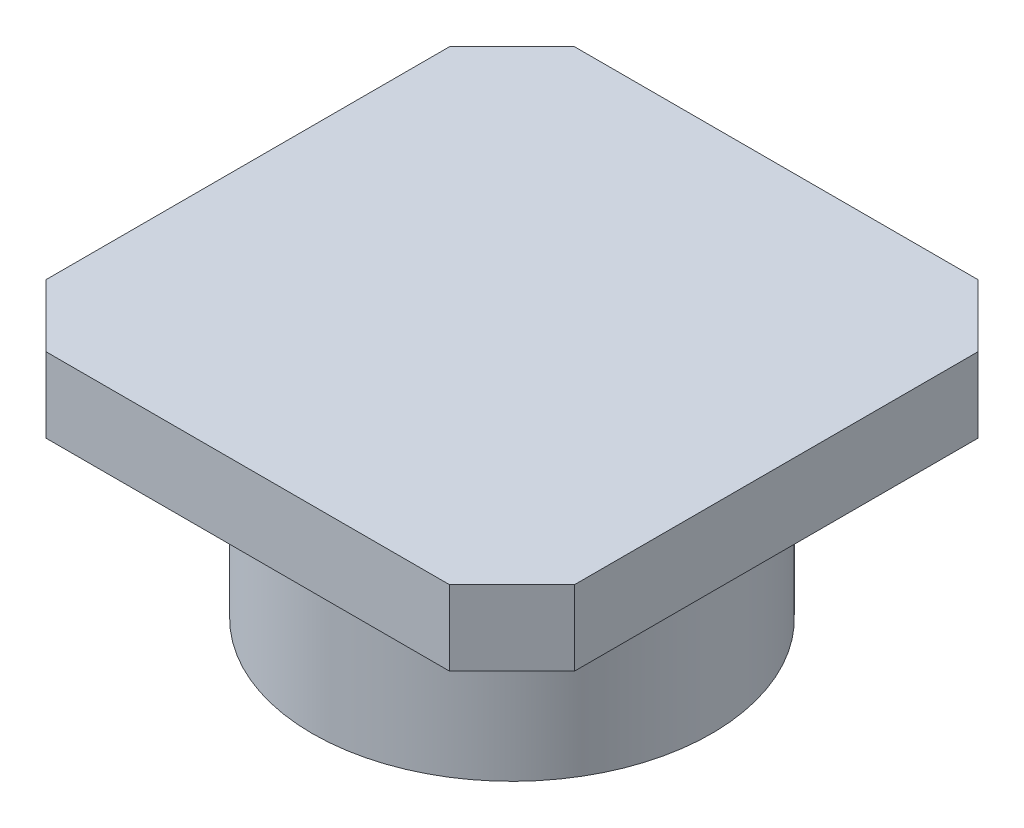
ISO-10303-21;
HEADER;
FILE_DESCRIPTION(('STEP AP214'),'2;1');
FILE_NAME('part.step','',(''),(''),'','','');
FILE_SCHEMA(('AUTOMOTIVE_DESIGN { 1 0 10303 214 1 1 1 1 }'));
ENDSEC;
DATA;
#1=APPLICATION_CONTEXT('core data for automotive mechanical design processes');
#2=APPLICATION_PROTOCOL_DEFINITION('international standard','automotive_design',2000,#1);
#3=PRODUCT_CONTEXT('',#1,'mechanical');
#4=PRODUCT('Part','Part','',(#3));
#5=PRODUCT_RELATED_PRODUCT_CATEGORY('part','',(#4));
#6=PRODUCT_DEFINITION_FORMATION('','',#4);
#7=PRODUCT_DEFINITION_CONTEXT('part definition',#1,'design');
#8=PRODUCT_DEFINITION('design','',#6,#7);
#9=PRODUCT_DEFINITION_SHAPE('','',#8);
#10=(LENGTH_UNIT() NAMED_UNIT(*) SI_UNIT(.MILLI.,.METRE.));
#11=(NAMED_UNIT(*) PLANE_ANGLE_UNIT() SI_UNIT($,.RADIAN.));
#12=(NAMED_UNIT(*) SI_UNIT($,.STERADIAN.) SOLID_ANGLE_UNIT());
#13=UNCERTAINTY_MEASURE_WITH_UNIT(LENGTH_MEASURE(1.E-05),#10,'distance_accuracy_value','');
#14=(GEOMETRIC_REPRESENTATION_CONTEXT(3) GLOBAL_UNCERTAINTY_ASSIGNED_CONTEXT((#13)) GLOBAL_UNIT_ASSIGNED_CONTEXT((#10,
#11,#12)) REPRESENTATION_CONTEXT('',''));
#15=CARTESIAN_POINT('',(0.,0.,0.));
#16=DIRECTION('',(0.,0.,1.));
#17=DIRECTION('',(1.,0.,0.));
#18=AXIS2_PLACEMENT_3D('',#15,#16,#17);
#19=CARTESIAN_POINT('',(0.,15.,0.));
#20=DIRECTION('',(0.,1.,0.));
#21=DIRECTION('',(0.,0.,1.));
#22=AXIS2_PLACEMENT_3D('',#19,#20,#21);
#23=PLANE('',#22);
#24=CARTESIAN_POINT('',(0.,15.,0.));
#25=DIRECTION('',(0.,1.,0.));
#26=DIRECTION('',(0.,0.,1.));
#27=AXIS2_PLACEMENT_3D('',#24,#25,#26);
#28=CIRCLE('',#27,18.);
#29=CARTESIAN_POINT('',(0.,15.,18.));
#30=VERTEX_POINT('',#29);
#31=EDGE_CURVE('E38',#30,#30,#28,.T.);
#32=ORIENTED_EDGE('',*,*,#31,.T.);
#33=EDGE_LOOP('',(#32));
#34=FACE_BOUND('',#33,.T.);
#35=DIRECTION('',(0.,0.,1.));
#36=VECTOR('',#35,1.);
#37=CARTESIAN_POINT('',(-21.169262219772,15.,0.));
#38=LINE('',#37,#36);
#39=CARTESIAN_POINT('',(-21.169262219772,15.,-16.169262219772));
#40=VERTEX_POINT('',#39);
#41=CARTESIAN_POINT('',(-21.169262219772,15.,16.169262219772));
#42=VERTEX_POINT('',#41);
#43=EDGE_CURVE('E156',#40,#42,#38,.T.);
#44=ORIENTED_EDGE('',*,*,#43,.F.);
#45=DIRECTION('',(-0.707106781186547,0.,0.707106781186548));
#46=VECTOR('',#45,1.);
#47=CARTESIAN_POINT('',(-18.669262219772,15.,-18.669262219772));
#48=LINE('',#47,#46);
#49=CARTESIAN_POINT('',(-16.169262219772,15.,-21.169262219772));
#50=VERTEX_POINT('',#49);
#51=EDGE_CURVE('E154',#50,#40,#48,.T.);
#52=ORIENTED_EDGE('',*,*,#51,.F.);
#53=DIRECTION('',(-1.,0.,0.));
#54=VECTOR('',#53,1.);
#55=CARTESIAN_POINT('',(0.,15.,-21.169262219772));
#56=LINE('',#55,#54);
#57=CARTESIAN_POINT('',(16.169262219772,15.,-21.169262219772));
#58=VERTEX_POINT('',#57);
#59=EDGE_CURVE('E152',#58,#50,#56,.T.);
#60=ORIENTED_EDGE('',*,*,#59,.F.);
#61=DIRECTION('',(-0.707106781186548,0.,-0.707106781186548));
#62=VECTOR('',#61,1.);
#63=CARTESIAN_POINT('',(18.669262219772,15.,-18.669262219772));
#64=LINE('',#63,#62);
#65=CARTESIAN_POINT('',(21.169262219772,15.,-16.169262219772));
#66=VERTEX_POINT('',#65);
#67=EDGE_CURVE('E150',#66,#58,#64,.T.);
#68=ORIENTED_EDGE('',*,*,#67,.F.);
#69=DIRECTION('',(0.,0.,-1.));
#70=VECTOR('',#69,1.);
#71=CARTESIAN_POINT('',(21.169262219772,15.,0.));
#72=LINE('',#71,#70);
#73=CARTESIAN_POINT('',(21.169262219772,15.,16.169262219772));
#74=VERTEX_POINT('',#73);
#75=EDGE_CURVE('E148',#74,#66,#72,.T.);
#76=ORIENTED_EDGE('',*,*,#75,.F.);
#77=DIRECTION('',(0.707106781186548,0.,-0.707106781186548));
#78=VECTOR('',#77,1.);
#79=CARTESIAN_POINT('',(18.669262219772,15.,18.669262219772));
#80=LINE('',#79,#78);
#81=CARTESIAN_POINT('',(16.169262219772,15.,21.169262219772));
#82=VERTEX_POINT('',#81);
#83=EDGE_CURVE('E146',#82,#74,#80,.T.);
#84=ORIENTED_EDGE('',*,*,#83,.F.);
#85=DIRECTION('',(1.,0.,0.));
#86=VECTOR('',#85,1.);
#87=CARTESIAN_POINT('',(0.,15.,21.169262219772));
#88=LINE('',#87,#86);
#89=CARTESIAN_POINT('',(-16.169262219772,15.,21.169262219772));
#90=VERTEX_POINT('',#89);
#91=EDGE_CURVE('E98',#90,#82,#88,.T.);
#92=ORIENTED_EDGE('',*,*,#91,.F.);
#93=DIRECTION('',(0.707106781186548,0.,0.707106781186547));
#94=VECTOR('',#93,1.);
#95=CARTESIAN_POINT('',(-18.669262219772,15.,18.669262219772));
#96=LINE('',#95,#94);
#97=EDGE_CURVE('E134',#42,#90,#96,.T.);
#98=ORIENTED_EDGE('',*,*,#97,.F.);
#99=EDGE_LOOP('',(#44,#52,#60,#68,#76,#84,#92,#98));
#100=FACE_BOUND('',#99,.T.);
#101=ADVANCED_FACE('F30',(#34,#100),#23,.F.);
#102=CARTESIAN_POINT('',(0.,0.,0.));
#103=DIRECTION('',(0.,1.,0.));
#104=DIRECTION('',(0.,0.,1.));
#105=AXIS2_PLACEMENT_3D('',#102,#103,#104);
#106=PLANE('',#105);
#107=CARTESIAN_POINT('',(0.,0.,0.));
#108=DIRECTION('',(0.,1.,0.));
#109=DIRECTION('',(0.,0.,1.));
#110=AXIS2_PLACEMENT_3D('',#107,#108,#109);
#111=CIRCLE('',#110,16.);
#112=CARTESIAN_POINT('',(0.,0.,16.));
#113=VERTEX_POINT('',#112);
#114=EDGE_CURVE('E164',#113,#113,#111,.T.);
#115=ORIENTED_EDGE('',*,*,#114,.F.);
#116=EDGE_LOOP('',(#115));
#117=FACE_BOUND('',#116,.T.);
#118=CARTESIAN_POINT('',(0.,0.,0.));
#119=DIRECTION('',(0.,1.,0.));
#120=DIRECTION('',(0.,0.,1.));
#121=AXIS2_PLACEMENT_3D('',#118,#119,#120);
#122=CIRCLE('',#121,12.5);
#123=CARTESIAN_POINT('',(0.,0.,12.5));
#124=VERTEX_POINT('',#123);
#125=EDGE_CURVE('E161',#124,#124,#122,.T.);
#126=ORIENTED_EDGE('',*,*,#125,.T.);
#127=EDGE_LOOP('',(#126));
#128=FACE_BOUND('',#127,.T.);
#129=ADVANCED_FACE('F187',(#117,#128),#106,.F.);
#130=CARTESIAN_POINT('',(0.,15.,0.));
#131=DIRECTION('',(0.,-1.,0.));
#132=DIRECTION('',(0.,0.,-1.));
#133=AXIS2_PLACEMENT_3D('',#130,#131,#132);
#134=CYLINDRICAL_SURFACE('',#133,16.);
#135=CARTESIAN_POINT('',(0.,13.,0.));
#136=DIRECTION('',(0.,1.,0.));
#137=DIRECTION('',(0.,0.,1.));
#138=AXIS2_PLACEMENT_3D('',#135,#136,#137);
#139=CIRCLE('',#138,16.);
#140=CARTESIAN_POINT('',(0.,13.,16.));
#141=VERTEX_POINT('',#140);
#142=EDGE_CURVE('E11',#141,#141,#139,.F.);
#143=ORIENTED_EDGE('',*,*,#142,.T.);
#144=EDGE_LOOP('',(#143));
#145=FACE_BOUND('',#144,.T.);
#146=ORIENTED_EDGE('',*,*,#114,.T.);
#147=EDGE_LOOP('',(#146));
#148=FACE_BOUND('',#147,.T.);
#149=ADVANCED_FACE('F191',(#145,#148),#134,.T.);
#150=CARTESIAN_POINT('',(0.,15.,0.));
#151=DIRECTION('',(0.,-1.,0.));
#152=DIRECTION('',(0.,0.,-1.));
#153=AXIS2_PLACEMENT_3D('',#150,#151,#152);
#154=CYLINDRICAL_SURFACE('',#153,12.5);
#155=CARTESIAN_POINT('',(0.,15.,0.));
#156=DIRECTION('',(0.,1.,0.));
#157=DIRECTION('',(0.,0.,1.));
#158=AXIS2_PLACEMENT_3D('',#155,#156,#157);
#159=CIRCLE('',#158,12.5);
#160=CARTESIAN_POINT('',(0.,15.,12.5));
#161=VERTEX_POINT('',#160);
#162=EDGE_CURVE('E158',#161,#161,#159,.T.);
#163=ORIENTED_EDGE('',*,*,#162,.T.);
#164=EDGE_LOOP('',(#163));
#165=FACE_BOUND('',#164,.T.);
#166=ORIENTED_EDGE('',*,*,#125,.F.);
#167=EDGE_LOOP('',(#166));
#168=FACE_BOUND('',#167,.T.);
#169=ADVANCED_FACE('F182',(#165,#168),#154,.F.);
#170=ORIENTED_EDGE('',*,*,#162,.F.);
#171=EDGE_LOOP('',(#170));
#172=FACE_BOUND('',#171,.T.);
#173=ADVANCED_FACE('F173',(#172),#23,.F.);
#174=CARTESIAN_POINT('',(0.,13.,0.));
#175=DIRECTION('',(0.,1.,0.));
#176=DIRECTION('',(0.,0.,1.));
#177=AXIS2_PLACEMENT_3D('',#174,#175,#176);
#178=TOROIDAL_SURFACE('',#177,18.,2.);
#179=ORIENTED_EDGE('',*,*,#142,.F.);
#180=EDGE_LOOP('',(#179));
#181=FACE_BOUND('',#180,.T.);
#182=ORIENTED_EDGE('',*,*,#31,.F.);
#183=EDGE_LOOP('',(#182));
#184=FACE_BOUND('',#183,.T.);
#185=ADVANCED_FACE('F32',(#181,#184),#178,.F.);
#186=CARTESIAN_POINT('',(-21.169262219772,11.,16.169262219772));
#187=DIRECTION('',(-1.,0.,0.));
#188=DIRECTION('',(0.,0.,1.));
#189=AXIS2_PLACEMENT_3D('',#186,#187,#188);
#190=PLANE('',#189);
#191=ORIENTED_EDGE('',*,*,#43,.T.);
#192=DIRECTION('',(0.,1.,0.));
#193=VECTOR('',#192,1.);
#194=CARTESIAN_POINT('',(-21.169262219772,11.,16.169262219772));
#195=LINE('',#194,#193);
#196=CARTESIAN_POINT('',(-21.169262219772,21.,16.169262219772));
#197=VERTEX_POINT('',#196);
#198=EDGE_CURVE('E45',#42,#197,#195,.T.);
#199=ORIENTED_EDGE('',*,*,#198,.T.);
#200=DIRECTION('',(0.,0.,1.));
#201=VECTOR('',#200,1.);
#202=CARTESIAN_POINT('',(-21.169262219772,21.,16.169262219772));
#203=LINE('',#202,#201);
#204=CARTESIAN_POINT('',(-21.169262219772,21.,-16.169262219772));
#205=VERTEX_POINT('',#204);
#206=EDGE_CURVE('E119',#205,#197,#203,.T.);
#207=ORIENTED_EDGE('',*,*,#206,.F.);
#208=DIRECTION('',(0.,1.,0.));
#209=VECTOR('',#208,1.);
#210=CARTESIAN_POINT('',(-21.169262219772,11.,-16.169262219772));
#211=LINE('',#210,#209);
#212=EDGE_CURVE('E132',#40,#205,#211,.T.);
#213=ORIENTED_EDGE('',*,*,#212,.F.);
#214=EDGE_LOOP('',(#191,#199,#207,#213));
#215=FACE_BOUND('',#214,.T.);
#216=ADVANCED_FACE('F172',(#215),#190,.T.);
#217=CARTESIAN_POINT('',(-21.169262219772,11.,-16.169262219772));
#218=DIRECTION('',(-0.707106781186548,0.,-0.707106781186547));
#219=DIRECTION('',(-0.707106781186547,0.,0.707106781186548));
#220=AXIS2_PLACEMENT_3D('',#217,#218,#219);
#221=PLANE('',#220);
#222=ORIENTED_EDGE('',*,*,#51,.T.);
#223=ORIENTED_EDGE('',*,*,#212,.T.);
#224=DIRECTION('',(-0.707106781186547,0.,0.707106781186548));
#225=VECTOR('',#224,1.);
#226=CARTESIAN_POINT('',(-21.169262219772,21.,-16.169262219772));
#227=LINE('',#226,#225);
#228=CARTESIAN_POINT('',(-16.169262219772,21.,-21.169262219772));
#229=VERTEX_POINT('',#228);
#230=EDGE_CURVE('E130',#229,#205,#227,.T.);
#231=ORIENTED_EDGE('',*,*,#230,.F.);
#232=DIRECTION('',(0.,1.,0.));
#233=VECTOR('',#232,1.);
#234=CARTESIAN_POINT('',(-16.169262219772,11.,-21.169262219772));
#235=LINE('',#234,#233);
#236=EDGE_CURVE('E135',#50,#229,#235,.T.);
#237=ORIENTED_EDGE('',*,*,#236,.F.);
#238=EDGE_LOOP('',(#222,#223,#231,#237));
#239=FACE_BOUND('',#238,.T.);
#240=ADVANCED_FACE('F179',(#239),#221,.T.);
#241=CARTESIAN_POINT('',(-16.169262219772,11.,-21.169262219772));
#242=DIRECTION('',(0.,0.,-1.));
#243=DIRECTION('',(-1.,0.,0.));
#244=AXIS2_PLACEMENT_3D('',#241,#242,#243);
#245=PLANE('',#244);
#246=ORIENTED_EDGE('',*,*,#59,.T.);
#247=ORIENTED_EDGE('',*,*,#236,.T.);
#248=DIRECTION('',(-1.,0.,0.));
#249=VECTOR('',#248,1.);
#250=CARTESIAN_POINT('',(-16.169262219772,21.,-21.169262219772));
#251=LINE('',#250,#249);
#252=CARTESIAN_POINT('',(16.169262219772,21.,-21.169262219772));
#253=VERTEX_POINT('',#252);
#254=EDGE_CURVE('E127',#253,#229,#251,.T.);
#255=ORIENTED_EDGE('',*,*,#254,.F.);
#256=DIRECTION('',(0.,1.,0.));
#257=VECTOR('',#256,1.);
#258=CARTESIAN_POINT('',(16.169262219772,11.,-21.169262219772));
#259=LINE('',#258,#257);
#260=EDGE_CURVE('E137',#58,#253,#259,.T.);
#261=ORIENTED_EDGE('',*,*,#260,.F.);
#262=EDGE_LOOP('',(#246,#247,#255,#261));
#263=FACE_BOUND('',#262,.T.);
#264=ADVANCED_FACE('F250',(#263),#245,.T.);
#265=CARTESIAN_POINT('',(16.169262219772,11.,-21.169262219772));
#266=DIRECTION('',(0.707106781186548,0.,-0.707106781186548));
#267=DIRECTION('',(-0.707106781186548,0.,-0.707106781186548));
#268=AXIS2_PLACEMENT_3D('',#265,#266,#267);
#269=PLANE('',#268);
#270=ORIENTED_EDGE('',*,*,#67,.T.);
#271=ORIENTED_EDGE('',*,*,#260,.T.);
#272=DIRECTION('',(-0.707106781186548,0.,-0.707106781186548));
#273=VECTOR('',#272,1.);
#274=CARTESIAN_POINT('',(16.169262219772,21.,-21.169262219772));
#275=LINE('',#274,#273);
#276=CARTESIAN_POINT('',(21.169262219772,21.,-16.169262219772));
#277=VERTEX_POINT('',#276);
#278=EDGE_CURVE('E124',#277,#253,#275,.T.);
#279=ORIENTED_EDGE('',*,*,#278,.F.);
#280=DIRECTION('',(0.,1.,0.));
#281=VECTOR('',#280,1.);
#282=CARTESIAN_POINT('',(21.169262219772,11.,-16.169262219772));
#283=LINE('',#282,#281);
#284=EDGE_CURVE('E139',#66,#277,#283,.T.);
#285=ORIENTED_EDGE('',*,*,#284,.F.);
#286=EDGE_LOOP('',(#270,#271,#279,#285));
#287=FACE_BOUND('',#286,.T.);
#288=ADVANCED_FACE('F259',(#287),#269,.T.);
#289=CARTESIAN_POINT('',(21.169262219772,11.,16.169262219772));
#290=DIRECTION('',(1.,0.,0.));
#291=DIRECTION('',(0.,0.,-1.));
#292=AXIS2_PLACEMENT_3D('',#289,#290,#291);
#293=PLANE('',#292);
#294=ORIENTED_EDGE('',*,*,#75,.T.);
#295=ORIENTED_EDGE('',*,*,#284,.T.);
#296=DIRECTION('',(0.,0.,-1.));
#297=VECTOR('',#296,1.);
#298=CARTESIAN_POINT('',(21.169262219772,21.,16.169262219772));
#299=LINE('',#298,#297);
#300=CARTESIAN_POINT('',(21.169262219772,21.,16.169262219772));
#301=VERTEX_POINT('',#300);
#302=EDGE_CURVE('E111',#301,#277,#299,.T.);
#303=ORIENTED_EDGE('',*,*,#302,.F.);
#304=DIRECTION('',(0.,1.,0.));
#305=VECTOR('',#304,1.);
#306=CARTESIAN_POINT('',(21.169262219772,11.,16.169262219772));
#307=LINE('',#306,#305);
#308=EDGE_CURVE('E101',#74,#301,#307,.T.);
#309=ORIENTED_EDGE('',*,*,#308,.F.);
#310=EDGE_LOOP('',(#294,#295,#303,#309));
#311=FACE_BOUND('',#310,.T.);
#312=ADVANCED_FACE('F268',(#311),#293,.T.);
#313=CARTESIAN_POINT('',(16.169262219772,11.,21.169262219772));
#314=DIRECTION('',(0.707106781186548,0.,0.707106781186548));
#315=DIRECTION('',(0.707106781186548,0.,-0.707106781186548));
#316=AXIS2_PLACEMENT_3D('',#313,#314,#315);
#317=PLANE('',#316);
#318=ORIENTED_EDGE('',*,*,#83,.T.);
#319=ORIENTED_EDGE('',*,*,#308,.T.);
#320=DIRECTION('',(0.707106781186547,0.,-0.707106781186547));
#321=VECTOR('',#320,1.);
#322=CARTESIAN_POINT('',(16.169262219772,21.,21.169262219772));
#323=LINE('',#322,#321);
#324=CARTESIAN_POINT('',(16.169262219772,21.,21.169262219772));
#325=VERTEX_POINT('',#324);
#326=EDGE_CURVE('E105',#325,#301,#323,.T.);
#327=ORIENTED_EDGE('',*,*,#326,.F.);
#328=DIRECTION('',(0.,1.,0.));
#329=VECTOR('',#328,1.);
#330=CARTESIAN_POINT('',(16.169262219772,11.,21.169262219772));
#331=LINE('',#330,#329);
#332=EDGE_CURVE('E94',#82,#325,#331,.T.);
#333=ORIENTED_EDGE('',*,*,#332,.F.);
#334=EDGE_LOOP('',(#318,#319,#327,#333));
#335=FACE_BOUND('',#334,.T.);
#336=ADVANCED_FACE('F106',(#335),#317,.T.);
#337=CARTESIAN_POINT('',(-16.169262219772,11.,21.169262219772));
#338=DIRECTION('',(0.,0.,1.));
#339=DIRECTION('',(1.,0.,0.));
#340=AXIS2_PLACEMENT_3D('',#337,#338,#339);
#341=PLANE('',#340);
#342=ORIENTED_EDGE('',*,*,#91,.T.);
#343=ORIENTED_EDGE('',*,*,#332,.T.);
#344=DIRECTION('',(1.,0.,0.));
#345=VECTOR('',#344,1.);
#346=CARTESIAN_POINT('',(-16.169262219772,21.,21.169262219772));
#347=LINE('',#346,#345);
#348=CARTESIAN_POINT('',(-16.169262219772,21.,21.169262219772));
#349=VERTEX_POINT('',#348);
#350=EDGE_CURVE('E53',#349,#325,#347,.T.);
#351=ORIENTED_EDGE('',*,*,#350,.F.);
#352=DIRECTION('',(0.,1.,0.));
#353=VECTOR('',#352,1.);
#354=CARTESIAN_POINT('',(-16.169262219772,11.,21.169262219772));
#355=LINE('',#354,#353);
#356=EDGE_CURVE('E102',#90,#349,#355,.T.);
#357=ORIENTED_EDGE('',*,*,#356,.F.);
#358=EDGE_LOOP('',(#342,#343,#351,#357));
#359=FACE_BOUND('',#358,.T.);
#360=ADVANCED_FACE('F96',(#359),#341,.T.);
#361=CARTESIAN_POINT('',(-21.169262219772,11.,16.169262219772));
#362=DIRECTION('',(-0.707106781186547,0.,0.707106781186548));
#363=DIRECTION('',(0.707106781186548,0.,0.707106781186547));
#364=AXIS2_PLACEMENT_3D('',#361,#362,#363);
#365=PLANE('',#364);
#366=ORIENTED_EDGE('',*,*,#97,.T.);
#367=ORIENTED_EDGE('',*,*,#356,.T.);
#368=DIRECTION('',(0.707106781186548,0.,0.707106781186547));
#369=VECTOR('',#368,1.);
#370=CARTESIAN_POINT('',(-21.169262219772,21.,16.169262219772));
#371=LINE('',#370,#369);
#372=EDGE_CURVE('E117',#197,#349,#371,.T.);
#373=ORIENTED_EDGE('',*,*,#372,.F.);
#374=ORIENTED_EDGE('',*,*,#198,.F.);
#375=EDGE_LOOP('',(#366,#367,#373,#374));
#376=FACE_BOUND('',#375,.T.);
#377=ADVANCED_FACE('F233',(#376),#365,.T.);
#378=CARTESIAN_POINT('',(0.,21.,0.));
#379=DIRECTION('',(0.,1.,0.));
#380=DIRECTION('',(0.,0.,1.));
#381=AXIS2_PLACEMENT_3D('',#378,#379,#380);
#382=PLANE('',#381);
#383=ORIENTED_EDGE('',*,*,#230,.T.);
#384=ORIENTED_EDGE('',*,*,#206,.T.);
#385=ORIENTED_EDGE('',*,*,#372,.T.);
#386=ORIENTED_EDGE('',*,*,#350,.T.);
#387=ORIENTED_EDGE('',*,*,#326,.T.);
#388=ORIENTED_EDGE('',*,*,#302,.T.);
#389=ORIENTED_EDGE('',*,*,#278,.T.);
#390=ORIENTED_EDGE('',*,*,#254,.T.);
#391=EDGE_LOOP('',(#383,#384,#385,#386,#387,#388,#389,#390));
#392=FACE_BOUND('',#391,.T.);
#393=ADVANCED_FACE('F115',(#392),#382,.T.);
#394=CLOSED_SHELL('',(#101,#129,#149,#169,#173,#185,#216,#240,#264,#288,#312,#336,#360,#377,#393));
#395=MANIFOLD_SOLID_BREP('B2',#394);
#396=ADVANCED_BREP_SHAPE_REPRESENTATION('',(#18,#395),#14);
#397=SHAPE_DEFINITION_REPRESENTATION(#9,#396);
ENDSEC;
END-ISO-10303-21;
